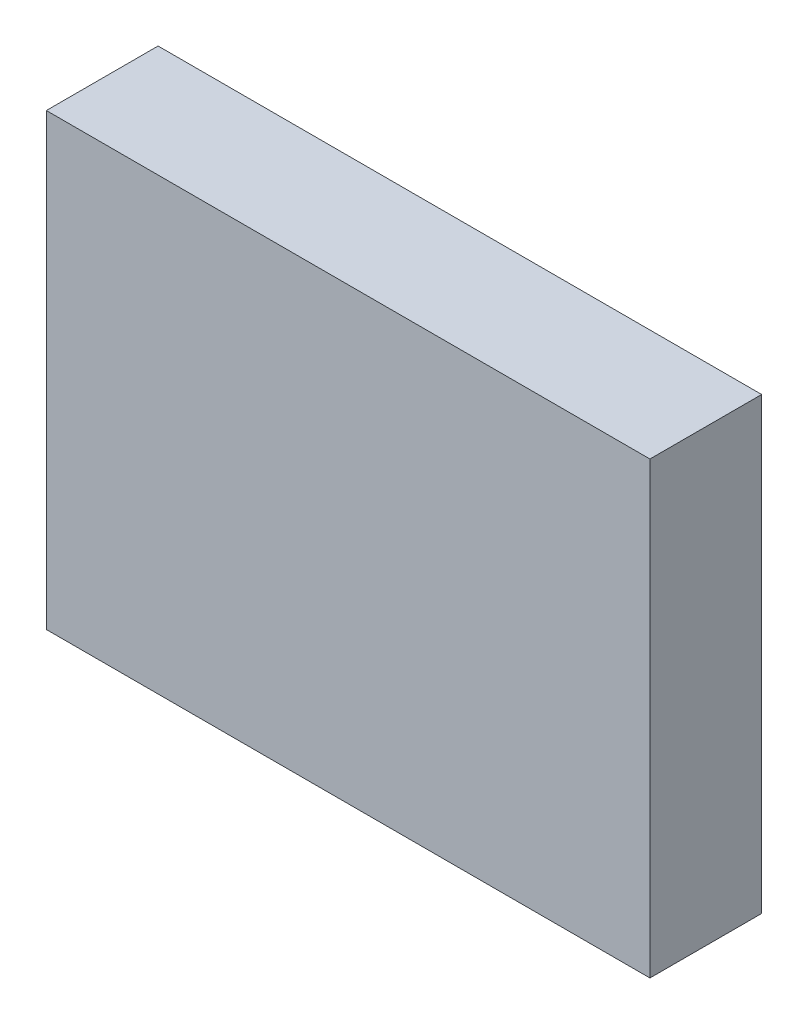
ISO-10303-21;
HEADER;
FILE_DESCRIPTION(('STEP AP214'),'2;1');
FILE_NAME('part.step','',(''),(''),'','','');
FILE_SCHEMA(('AUTOMOTIVE_DESIGN { 1 0 10303 214 1 1 1 1 }'));
ENDSEC;
DATA;
#1=APPLICATION_CONTEXT('core data for automotive mechanical design processes');
#2=APPLICATION_PROTOCOL_DEFINITION('international standard','automotive_design',2000,#1);
#3=PRODUCT_CONTEXT('',#1,'mechanical');
#4=PRODUCT('Part','Part','',(#3));
#5=PRODUCT_RELATED_PRODUCT_CATEGORY('part','',(#4));
#6=PRODUCT_DEFINITION_FORMATION('','',#4);
#7=PRODUCT_DEFINITION_CONTEXT('part definition',#1,'design');
#8=PRODUCT_DEFINITION('design','',#6,#7);
#9=PRODUCT_DEFINITION_SHAPE('','',#8);
#10=(LENGTH_UNIT() NAMED_UNIT(*) SI_UNIT(.MILLI.,.METRE.));
#11=(NAMED_UNIT(*) PLANE_ANGLE_UNIT() SI_UNIT($,.RADIAN.));
#12=(NAMED_UNIT(*) SI_UNIT($,.STERADIAN.) SOLID_ANGLE_UNIT());
#13=UNCERTAINTY_MEASURE_WITH_UNIT(LENGTH_MEASURE(1.E-05),#10,'distance_accuracy_value','');
#14=(GEOMETRIC_REPRESENTATION_CONTEXT(3) GLOBAL_UNCERTAINTY_ASSIGNED_CONTEXT((#13)) GLOBAL_UNIT_ASSIGNED_CONTEXT((#10,
#11,#12)) REPRESENTATION_CONTEXT('',''));
#15=CARTESIAN_POINT('',(0.,0.,0.));
#16=DIRECTION('',(0.,0.,1.));
#17=DIRECTION('',(1.,0.,0.));
#18=AXIS2_PLACEMENT_3D('',#15,#16,#17);
#19=CARTESIAN_POINT('',(23.5,17.5,8.7));
#20=DIRECTION('',(-1.,0.,0.));
#21=DIRECTION('',(0.,-1.,0.));
#22=AXIS2_PLACEMENT_3D('',#19,#20,#21);
#23=PLANE('',#22);
#24=DIRECTION('',(0.,1.,0.));
#25=VECTOR('',#24,1.);
#26=CARTESIAN_POINT('',(23.5,17.5,0.));
#27=LINE('',#26,#25);
#28=CARTESIAN_POINT('',(23.5,-17.5,0.));
#29=VERTEX_POINT('',#28);
#30=CARTESIAN_POINT('',(23.5,17.5,0.));
#31=VERTEX_POINT('',#30);
#32=EDGE_CURVE('E96',#29,#31,#27,.T.);
#33=ORIENTED_EDGE('',*,*,#32,.T.);
#34=DIRECTION('',(0.,0.,-1.));
#35=VECTOR('',#34,1.);
#36=CARTESIAN_POINT('',(23.5,17.5,8.7));
#37=LINE('',#36,#35);
#38=CARTESIAN_POINT('',(23.5,17.5,8.7));
#39=VERTEX_POINT('',#38);
#40=EDGE_CURVE('E11',#39,#31,#37,.T.);
#41=ORIENTED_EDGE('',*,*,#40,.F.);
#42=DIRECTION('',(0.,1.,0.));
#43=VECTOR('',#42,1.);
#44=CARTESIAN_POINT('',(23.5,17.5,8.7));
#45=LINE('',#44,#43);
#46=CARTESIAN_POINT('',(23.5,-17.5,8.7));
#47=VERTEX_POINT('',#46);
#48=EDGE_CURVE('E84',#47,#39,#45,.T.);
#49=ORIENTED_EDGE('',*,*,#48,.F.);
#50=DIRECTION('',(0.,0.,-1.));
#51=VECTOR('',#50,1.);
#52=CARTESIAN_POINT('',(23.5,-17.5,8.7));
#53=LINE('',#52,#51);
#54=EDGE_CURVE('E92',#47,#29,#53,.T.);
#55=ORIENTED_EDGE('',*,*,#54,.T.);
#56=EDGE_LOOP('',(#33,#41,#49,#55));
#57=FACE_BOUND('',#56,.T.);
#58=ADVANCED_FACE('F33',(#57),#23,.F.);
#59=CARTESIAN_POINT('',(-23.5,17.5,8.7));
#60=DIRECTION('',(0.,-1.,0.));
#61=DIRECTION('',(0.,0.,-1.));
#62=AXIS2_PLACEMENT_3D('',#59,#60,#61);
#63=PLANE('',#62);
#64=DIRECTION('',(-1.,0.,0.));
#65=VECTOR('',#64,1.);
#66=CARTESIAN_POINT('',(-23.5,17.5,0.));
#67=LINE('',#66,#65);
#68=CARTESIAN_POINT('',(-23.5,17.5,0.));
#69=VERTEX_POINT('',#68);
#70=EDGE_CURVE('E88',#31,#69,#67,.T.);
#71=ORIENTED_EDGE('',*,*,#70,.T.);
#72=DIRECTION('',(0.,0.,-1.));
#73=VECTOR('',#72,1.);
#74=CARTESIAN_POINT('',(-23.5,17.5,8.7));
#75=LINE('',#74,#73);
#76=CARTESIAN_POINT('',(-23.5,17.5,8.7));
#77=VERTEX_POINT('',#76);
#78=EDGE_CURVE('E41',#77,#69,#75,.T.);
#79=ORIENTED_EDGE('',*,*,#78,.F.);
#80=DIRECTION('',(-1.,0.,0.));
#81=VECTOR('',#80,1.);
#82=CARTESIAN_POINT('',(-23.5,17.5,8.7));
#83=LINE('',#82,#81);
#84=EDGE_CURVE('E79',#39,#77,#83,.T.);
#85=ORIENTED_EDGE('',*,*,#84,.F.);
#86=ORIENTED_EDGE('',*,*,#40,.T.);
#87=EDGE_LOOP('',(#71,#79,#85,#86));
#88=FACE_BOUND('',#87,.T.);
#89=ADVANCED_FACE('F87',(#88),#63,.F.);
#90=CARTESIAN_POINT('',(-23.5,17.5,8.7));
#91=DIRECTION('',(1.,0.,0.));
#92=DIRECTION('',(0.,1.,0.));
#93=AXIS2_PLACEMENT_3D('',#90,#91,#92);
#94=PLANE('',#93);
#95=DIRECTION('',(0.,-1.,0.));
#96=VECTOR('',#95,1.);
#97=CARTESIAN_POINT('',(-23.5,17.5,0.));
#98=LINE('',#97,#96);
#99=CARTESIAN_POINT('',(-23.5,-17.5,0.));
#100=VERTEX_POINT('',#99);
#101=EDGE_CURVE('E66',#69,#100,#98,.T.);
#102=ORIENTED_EDGE('',*,*,#101,.T.);
#103=DIRECTION('',(0.,0.,-1.));
#104=VECTOR('',#103,1.);
#105=CARTESIAN_POINT('',(-23.5,-17.5,8.7));
#106=LINE('',#105,#104);
#107=CARTESIAN_POINT('',(-23.5,-17.5,8.7));
#108=VERTEX_POINT('',#107);
#109=EDGE_CURVE('E89',#108,#100,#106,.T.);
#110=ORIENTED_EDGE('',*,*,#109,.F.);
#111=DIRECTION('',(0.,-1.,0.));
#112=VECTOR('',#111,1.);
#113=CARTESIAN_POINT('',(-23.5,17.5,8.7));
#114=LINE('',#113,#112);
#115=EDGE_CURVE('E82',#77,#108,#114,.T.);
#116=ORIENTED_EDGE('',*,*,#115,.F.);
#117=ORIENTED_EDGE('',*,*,#78,.T.);
#118=EDGE_LOOP('',(#102,#110,#116,#117));
#119=FACE_BOUND('',#118,.T.);
#120=ADVANCED_FACE('F90',(#119),#94,.F.);
#121=CARTESIAN_POINT('',(-23.5,-17.5,8.7));
#122=DIRECTION('',(0.,1.,0.));
#123=DIRECTION('',(0.,0.,1.));
#124=AXIS2_PLACEMENT_3D('',#121,#122,#123);
#125=PLANE('',#124);
#126=DIRECTION('',(1.,0.,0.));
#127=VECTOR('',#126,1.);
#128=CARTESIAN_POINT('',(-23.5,-17.5,0.));
#129=LINE('',#128,#127);
#130=EDGE_CURVE('E72',#100,#29,#129,.T.);
#131=ORIENTED_EDGE('',*,*,#130,.T.);
#132=ORIENTED_EDGE('',*,*,#54,.F.);
#133=DIRECTION('',(1.,0.,0.));
#134=VECTOR('',#133,1.);
#135=CARTESIAN_POINT('',(-23.5,-17.5,8.7));
#136=LINE('',#135,#134);
#137=EDGE_CURVE('E49',#108,#47,#136,.T.);
#138=ORIENTED_EDGE('',*,*,#137,.F.);
#139=ORIENTED_EDGE('',*,*,#109,.T.);
#140=EDGE_LOOP('',(#131,#132,#138,#139));
#141=FACE_BOUND('',#140,.T.);
#142=ADVANCED_FACE('F103',(#141),#125,.F.);
#143=CARTESIAN_POINT('',(0.,0.,8.7));
#144=DIRECTION('',(0.,0.,1.));
#145=DIRECTION('',(1.,0.,0.));
#146=AXIS2_PLACEMENT_3D('',#143,#144,#145);
#147=PLANE('',#146);
#148=ORIENTED_EDGE('',*,*,#48,.T.);
#149=ORIENTED_EDGE('',*,*,#84,.T.);
#150=ORIENTED_EDGE('',*,*,#115,.T.);
#151=ORIENTED_EDGE('',*,*,#137,.T.);
#152=EDGE_LOOP('',(#148,#149,#150,#151));
#153=FACE_BOUND('',#152,.T.);
#154=ADVANCED_FACE('F80',(#153),#147,.T.);
#155=CARTESIAN_POINT('',(0.,0.,0.));
#156=DIRECTION('',(0.,0.,1.));
#157=DIRECTION('',(1.,0.,0.));
#158=AXIS2_PLACEMENT_3D('',#155,#156,#157);
#159=PLANE('',#158);
#160=ORIENTED_EDGE('',*,*,#32,.F.);
#161=ORIENTED_EDGE('',*,*,#130,.F.);
#162=ORIENTED_EDGE('',*,*,#101,.F.);
#163=ORIENTED_EDGE('',*,*,#70,.F.);
#164=EDGE_LOOP('',(#160,#161,#162,#163));
#165=FACE_BOUND('',#164,.T.);
#166=ADVANCED_FACE('F106',(#165),#159,.F.);
#167=CLOSED_SHELL('',(#58,#89,#120,#142,#154,#166));
#168=MANIFOLD_SOLID_BREP('B2',#167);
#169=ADVANCED_BREP_SHAPE_REPRESENTATION('',(#18,#168),#14);
#170=SHAPE_DEFINITION_REPRESENTATION(#9,#169);
ENDSEC;
END-ISO-10303-21;
